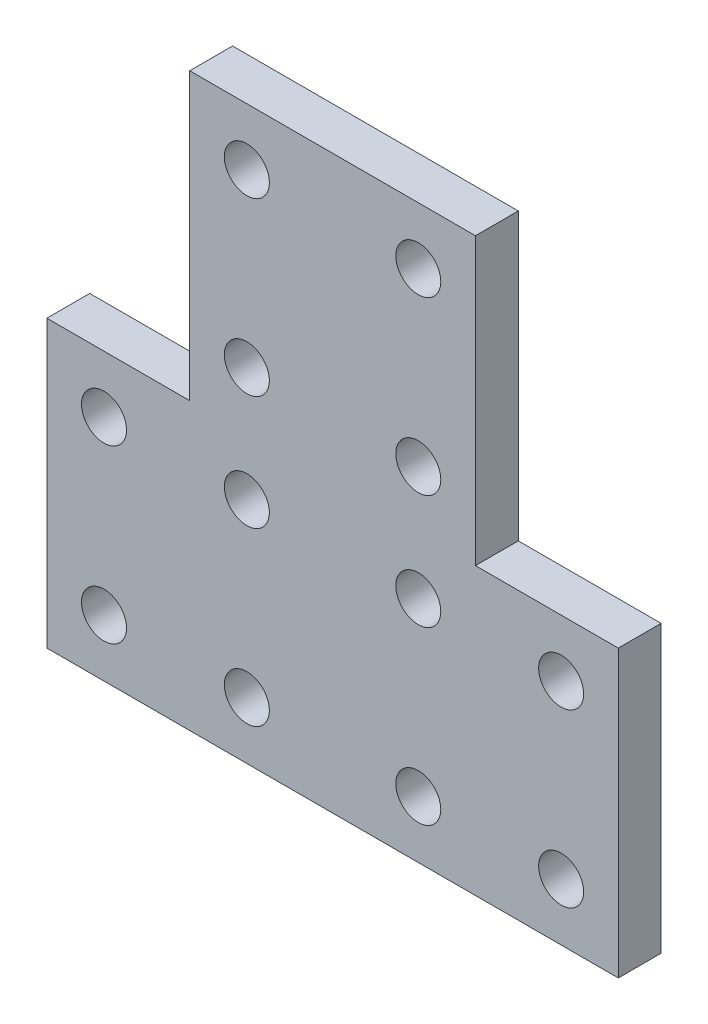
ISO-10303-21;
HEADER;
FILE_DESCRIPTION(('STEP AP214'),'2;1');
FILE_NAME('part.step','',(''),(''),'','','');
FILE_SCHEMA(('AUTOMOTIVE_DESIGN { 1 0 10303 214 1 1 1 1 }'));
ENDSEC;
DATA;
#1=APPLICATION_CONTEXT('core data for automotive mechanical design processes');
#2=APPLICATION_PROTOCOL_DEFINITION('international standard','automotive_design',2000,#1);
#3=PRODUCT_CONTEXT('',#1,'mechanical');
#4=PRODUCT('Part','Part','',(#3));
#5=PRODUCT_RELATED_PRODUCT_CATEGORY('part','',(#4));
#6=PRODUCT_DEFINITION_FORMATION('','',#4);
#7=PRODUCT_DEFINITION_CONTEXT('part definition',#1,'design');
#8=PRODUCT_DEFINITION('design','',#6,#7);
#9=PRODUCT_DEFINITION_SHAPE('','',#8);
#10=(LENGTH_UNIT() NAMED_UNIT(*) SI_UNIT(.MILLI.,.METRE.));
#11=(NAMED_UNIT(*) PLANE_ANGLE_UNIT() SI_UNIT($,.RADIAN.));
#12=(NAMED_UNIT(*) SI_UNIT($,.STERADIAN.) SOLID_ANGLE_UNIT());
#13=UNCERTAINTY_MEASURE_WITH_UNIT(LENGTH_MEASURE(1.E-05),#10,'distance_accuracy_value','');
#14=(GEOMETRIC_REPRESENTATION_CONTEXT(3) GLOBAL_UNCERTAINTY_ASSIGNED_CONTEXT((#13)) GLOBAL_UNIT_ASSIGNED_CONTEXT((#10,
#11,#12)) REPRESENTATION_CONTEXT('',''));
#15=CARTESIAN_POINT('',(0.,0.,0.));
#16=DIRECTION('',(0.,0.,1.));
#17=DIRECTION('',(1.,0.,0.));
#18=AXIS2_PLACEMENT_3D('',#15,#16,#17);
#19=CARTESIAN_POINT('',(0.,20.,3.));
#20=DIRECTION('',(1.,0.,0.));
#21=DIRECTION('',(0.,0.,-1.));
#22=AXIS2_PLACEMENT_3D('',#19,#20,#21);
#23=PLANE('',#22);
#24=DIRECTION('',(0.,-1.,0.));
#25=VECTOR('',#24,1.);
#26=CARTESIAN_POINT('',(0.,20.,0.));
#27=LINE('',#26,#25);
#28=CARTESIAN_POINT('',(0.,20.,0.));
#29=VERTEX_POINT('',#28);
#30=CARTESIAN_POINT('',(0.,0.,0.));
#31=VERTEX_POINT('',#30);
#32=EDGE_CURVE('E131',#29,#31,#27,.T.);
#33=ORIENTED_EDGE('',*,*,#32,.T.);
#34=DIRECTION('',(0.,0.,-1.));
#35=VECTOR('',#34,1.);
#36=CARTESIAN_POINT('',(0.,0.,3.));
#37=LINE('',#36,#35);
#38=CARTESIAN_POINT('',(0.,0.,3.));
#39=VERTEX_POINT('',#38);
#40=EDGE_CURVE('E11',#39,#31,#37,.T.);
#41=ORIENTED_EDGE('',*,*,#40,.F.);
#42=DIRECTION('',(0.,-1.,0.));
#43=VECTOR('',#42,1.);
#44=CARTESIAN_POINT('',(0.,20.,3.));
#45=LINE('',#44,#43);
#46=CARTESIAN_POINT('',(0.,20.,3.));
#47=VERTEX_POINT('',#46);
#48=EDGE_CURVE('E146',#47,#39,#45,.T.);
#49=ORIENTED_EDGE('',*,*,#48,.F.);
#50=DIRECTION('',(0.,0.,-1.));
#51=VECTOR('',#50,1.);
#52=CARTESIAN_POINT('',(0.,20.,3.));
#53=LINE('',#52,#51);
#54=EDGE_CURVE('E127',#47,#29,#53,.T.);
#55=ORIENTED_EDGE('',*,*,#54,.T.);
#56=EDGE_LOOP('',(#33,#41,#49,#55));
#57=FACE_BOUND('',#56,.T.);
#58=ADVANCED_FACE('F35',(#57),#23,.F.);
#59=CARTESIAN_POINT('',(0.,0.,3.));
#60=DIRECTION('',(0.,1.,0.));
#61=DIRECTION('',(0.,0.,1.));
#62=AXIS2_PLACEMENT_3D('',#59,#60,#61);
#63=PLANE('',#62);
#64=DIRECTION('',(1.,0.,0.));
#65=VECTOR('',#64,1.);
#66=CARTESIAN_POINT('',(0.,0.,0.));
#67=LINE('',#66,#65);
#68=CARTESIAN_POINT('',(40.,0.,0.));
#69=VERTEX_POINT('',#68);
#70=EDGE_CURVE('E134',#31,#69,#67,.T.);
#71=ORIENTED_EDGE('',*,*,#70,.T.);
#72=DIRECTION('',(0.,0.,-1.));
#73=VECTOR('',#72,1.);
#74=CARTESIAN_POINT('',(40.,0.,3.));
#75=LINE('',#74,#73);
#76=CARTESIAN_POINT('',(40.,0.,3.));
#77=VERTEX_POINT('',#76);
#78=EDGE_CURVE('E43',#77,#69,#75,.T.);
#79=ORIENTED_EDGE('',*,*,#78,.F.);
#80=DIRECTION('',(1.,0.,0.));
#81=VECTOR('',#80,1.);
#82=CARTESIAN_POINT('',(0.,0.,3.));
#83=LINE('',#82,#81);
#84=EDGE_CURVE('E94',#39,#77,#83,.T.);
#85=ORIENTED_EDGE('',*,*,#84,.F.);
#86=ORIENTED_EDGE('',*,*,#40,.T.);
#87=EDGE_LOOP('',(#71,#79,#85,#86));
#88=FACE_BOUND('',#87,.T.);
#89=ADVANCED_FACE('F288',(#88),#63,.F.);
#90=CARTESIAN_POINT('',(40.,0.,3.));
#91=DIRECTION('',(-1.,0.,0.));
#92=DIRECTION('',(0.,0.,1.));
#93=AXIS2_PLACEMENT_3D('',#90,#91,#92);
#94=PLANE('',#93);
#95=DIRECTION('',(0.,1.,0.));
#96=VECTOR('',#95,1.);
#97=CARTESIAN_POINT('',(40.,0.,0.));
#98=LINE('',#97,#96);
#99=CARTESIAN_POINT('',(40.,20.,0.));
#100=VERTEX_POINT('',#99);
#101=EDGE_CURVE('E137',#69,#100,#98,.T.);
#102=ORIENTED_EDGE('',*,*,#101,.T.);
#103=DIRECTION('',(0.,0.,-1.));
#104=VECTOR('',#103,1.);
#105=CARTESIAN_POINT('',(40.,20.,3.));
#106=LINE('',#105,#104);
#107=CARTESIAN_POINT('',(40.,20.,3.));
#108=VERTEX_POINT('',#107);
#109=EDGE_CURVE('E153',#108,#100,#106,.T.);
#110=ORIENTED_EDGE('',*,*,#109,.F.);
#111=DIRECTION('',(0.,1.,0.));
#112=VECTOR('',#111,1.);
#113=CARTESIAN_POINT('',(40.,0.,3.));
#114=LINE('',#113,#112);
#115=EDGE_CURVE('E161',#77,#108,#114,.T.);
#116=ORIENTED_EDGE('',*,*,#115,.F.);
#117=ORIENTED_EDGE('',*,*,#78,.T.);
#118=EDGE_LOOP('',(#102,#110,#116,#117));
#119=FACE_BOUND('',#118,.T.);
#120=ADVANCED_FACE('F159',(#119),#94,.F.);
#121=CARTESIAN_POINT('',(40.,20.,3.));
#122=DIRECTION('',(0.,-1.,0.));
#123=DIRECTION('',(1.,0.,0.));
#124=AXIS2_PLACEMENT_3D('',#121,#122,#123);
#125=PLANE('',#124);
#126=DIRECTION('',(-1.,0.,0.));
#127=VECTOR('',#126,1.);
#128=CARTESIAN_POINT('',(40.,20.,0.));
#129=LINE('',#128,#127);
#130=CARTESIAN_POINT('',(30.,20.,0.));
#131=VERTEX_POINT('',#130);
#132=EDGE_CURVE('E139',#100,#131,#129,.T.);
#133=ORIENTED_EDGE('',*,*,#132,.T.);
#134=DIRECTION('',(0.,0.,-1.));
#135=VECTOR('',#134,1.);
#136=CARTESIAN_POINT('',(30.,20.,3.));
#137=LINE('',#136,#135);
#138=CARTESIAN_POINT('',(30.,20.,3.));
#139=VERTEX_POINT('',#138);
#140=EDGE_CURVE('E150',#139,#131,#137,.T.);
#141=ORIENTED_EDGE('',*,*,#140,.F.);
#142=DIRECTION('',(-1.,0.,0.));
#143=VECTOR('',#142,1.);
#144=CARTESIAN_POINT('',(40.,20.,3.));
#145=LINE('',#144,#143);
#146=EDGE_CURVE('E173',#108,#139,#145,.T.);
#147=ORIENTED_EDGE('',*,*,#146,.F.);
#148=ORIENTED_EDGE('',*,*,#109,.T.);
#149=EDGE_LOOP('',(#133,#141,#147,#148));
#150=FACE_BOUND('',#149,.T.);
#151=ADVANCED_FACE('F169',(#150),#125,.F.);
#152=CARTESIAN_POINT('',(30.,20.,3.));
#153=DIRECTION('',(-1.,0.,0.));
#154=DIRECTION('',(0.,-1.,0.));
#155=AXIS2_PLACEMENT_3D('',#152,#153,#154);
#156=PLANE('',#155);
#157=DIRECTION('',(0.,1.,0.));
#158=VECTOR('',#157,1.);
#159=CARTESIAN_POINT('',(30.,20.,0.));
#160=LINE('',#159,#158);
#161=CARTESIAN_POINT('',(30.,40.,0.));
#162=VERTEX_POINT('',#161);
#163=EDGE_CURVE('E141',#131,#162,#160,.T.);
#164=ORIENTED_EDGE('',*,*,#163,.T.);
#165=DIRECTION('',(0.,0.,-1.));
#166=VECTOR('',#165,1.);
#167=CARTESIAN_POINT('',(30.,40.,3.));
#168=LINE('',#167,#166);
#169=CARTESIAN_POINT('',(30.,40.,3.));
#170=VERTEX_POINT('',#169);
#171=EDGE_CURVE('E122',#170,#162,#168,.T.);
#172=ORIENTED_EDGE('',*,*,#171,.F.);
#173=DIRECTION('',(0.,1.,0.));
#174=VECTOR('',#173,1.);
#175=CARTESIAN_POINT('',(30.,20.,3.));
#176=LINE('',#175,#174);
#177=EDGE_CURVE('E113',#139,#170,#176,.T.);
#178=ORIENTED_EDGE('',*,*,#177,.F.);
#179=ORIENTED_EDGE('',*,*,#140,.T.);
#180=EDGE_LOOP('',(#164,#172,#178,#179));
#181=FACE_BOUND('',#180,.T.);
#182=ADVANCED_FACE('F172',(#181),#156,.F.);
#183=CARTESIAN_POINT('',(30.,40.,3.));
#184=DIRECTION('',(0.,-1.,0.));
#185=DIRECTION('',(1.,0.,0.));
#186=AXIS2_PLACEMENT_3D('',#183,#184,#185);
#187=PLANE('',#186);
#188=DIRECTION('',(-1.,0.,0.));
#189=VECTOR('',#188,1.);
#190=CARTESIAN_POINT('',(30.,40.,0.));
#191=LINE('',#190,#189);
#192=CARTESIAN_POINT('',(9.99999999999999,40.,0.));
#193=VERTEX_POINT('',#192);
#194=EDGE_CURVE('E121',#162,#193,#191,.T.);
#195=ORIENTED_EDGE('',*,*,#194,.T.);
#196=DIRECTION('',(0.,0.,-1.));
#197=VECTOR('',#196,1.);
#198=CARTESIAN_POINT('',(9.99999999999999,40.,3.));
#199=LINE('',#198,#197);
#200=CARTESIAN_POINT('',(9.99999999999999,40.,3.));
#201=VERTEX_POINT('',#200);
#202=EDGE_CURVE('E118',#201,#193,#199,.T.);
#203=ORIENTED_EDGE('',*,*,#202,.F.);
#204=DIRECTION('',(-1.,0.,0.));
#205=VECTOR('',#204,1.);
#206=CARTESIAN_POINT('',(30.,40.,3.));
#207=LINE('',#206,#205);
#208=EDGE_CURVE('E107',#170,#201,#207,.T.);
#209=ORIENTED_EDGE('',*,*,#208,.F.);
#210=ORIENTED_EDGE('',*,*,#171,.T.);
#211=EDGE_LOOP('',(#195,#203,#209,#210));
#212=FACE_BOUND('',#211,.T.);
#213=ADVANCED_FACE('F119',(#212),#187,.F.);
#214=CARTESIAN_POINT('',(9.99999999999999,40.,3.));
#215=DIRECTION('',(1.,0.,0.));
#216=DIRECTION('',(0.,1.,0.));
#217=AXIS2_PLACEMENT_3D('',#214,#215,#216);
#218=PLANE('',#217);
#219=DIRECTION('',(0.,-1.,0.));
#220=VECTOR('',#219,1.);
#221=CARTESIAN_POINT('',(9.99999999999999,40.,0.));
#222=LINE('',#221,#220);
#223=CARTESIAN_POINT('',(10.,20.,0.));
#224=VERTEX_POINT('',#223);
#225=EDGE_CURVE('E80',#193,#224,#222,.T.);
#226=ORIENTED_EDGE('',*,*,#225,.T.);
#227=DIRECTION('',(0.,0.,-1.));
#228=VECTOR('',#227,1.);
#229=CARTESIAN_POINT('',(10.,20.,3.));
#230=LINE('',#229,#228);
#231=CARTESIAN_POINT('',(10.,20.,3.));
#232=VERTEX_POINT('',#231);
#233=EDGE_CURVE('E123',#232,#224,#230,.T.);
#234=ORIENTED_EDGE('',*,*,#233,.F.);
#235=DIRECTION('',(0.,-1.,0.));
#236=VECTOR('',#235,1.);
#237=CARTESIAN_POINT('',(9.99999999999999,40.,3.));
#238=LINE('',#237,#236);
#239=EDGE_CURVE('E111',#201,#232,#238,.T.);
#240=ORIENTED_EDGE('',*,*,#239,.F.);
#241=ORIENTED_EDGE('',*,*,#202,.T.);
#242=EDGE_LOOP('',(#226,#234,#240,#241));
#243=FACE_BOUND('',#242,.T.);
#244=ADVANCED_FACE('F125',(#243),#218,.F.);
#245=CARTESIAN_POINT('',(10.,20.,3.));
#246=DIRECTION('',(0.,-1.,0.));
#247=DIRECTION('',(0.,0.,-1.));
#248=AXIS2_PLACEMENT_3D('',#245,#246,#247);
#249=PLANE('',#248);
#250=DIRECTION('',(-1.,0.,0.));
#251=VECTOR('',#250,1.);
#252=CARTESIAN_POINT('',(10.,20.,0.));
#253=LINE('',#252,#251);
#254=EDGE_CURVE('E86',#224,#29,#253,.T.);
#255=ORIENTED_EDGE('',*,*,#254,.T.);
#256=ORIENTED_EDGE('',*,*,#54,.F.);
#257=DIRECTION('',(-1.,0.,0.));
#258=VECTOR('',#257,1.);
#259=CARTESIAN_POINT('',(10.,20.,3.));
#260=LINE('',#259,#258);
#261=EDGE_CURVE('E51',#232,#47,#260,.T.);
#262=ORIENTED_EDGE('',*,*,#261,.F.);
#263=ORIENTED_EDGE('',*,*,#233,.T.);
#264=EDGE_LOOP('',(#255,#256,#262,#263));
#265=FACE_BOUND('',#264,.T.);
#266=ADVANCED_FACE('F263',(#265),#249,.F.);
#267=CARTESIAN_POINT('',(0.,0.,3.));
#268=DIRECTION('',(0.,0.,1.));
#269=DIRECTION('',(1.,0.,0.));
#270=AXIS2_PLACEMENT_3D('',#267,#268,#269);
#271=PLANE('',#270);
#272=CARTESIAN_POINT('',(4.,4.,3.));
#273=DIRECTION('',(0.,0.,1.));
#274=DIRECTION('',(1.,0.,0.));
#275=AXIS2_PLACEMENT_3D('',#272,#273,#274);
#276=CIRCLE('',#275,1.575);
#277=CARTESIAN_POINT('',(5.575,4.,3.));
#278=VERTEX_POINT('',#277);
#279=EDGE_CURVE('E216',#278,#278,#276,.T.);
#280=ORIENTED_EDGE('',*,*,#279,.F.);
#281=EDGE_LOOP('',(#280));
#282=FACE_BOUND('',#281,.T.);
#283=CARTESIAN_POINT('',(14.,16.,3.));
#284=DIRECTION('',(0.,0.,1.));
#285=DIRECTION('',(1.,0.,0.));
#286=AXIS2_PLACEMENT_3D('',#283,#284,#285);
#287=CIRCLE('',#286,1.575);
#288=CARTESIAN_POINT('',(15.575,16.,3.));
#289=VERTEX_POINT('',#288);
#290=EDGE_CURVE('E209',#289,#289,#287,.T.);
#291=ORIENTED_EDGE('',*,*,#290,.F.);
#292=EDGE_LOOP('',(#291));
#293=FACE_BOUND('',#292,.T.);
#294=CARTESIAN_POINT('',(14.,4.,3.));
#295=DIRECTION('',(0.,0.,1.));
#296=DIRECTION('',(1.,0.,0.));
#297=AXIS2_PLACEMENT_3D('',#294,#295,#296);
#298=CIRCLE('',#297,1.575);
#299=CARTESIAN_POINT('',(15.575,4.,3.));
#300=VERTEX_POINT('',#299);
#301=EDGE_CURVE('E228',#300,#300,#298,.T.);
#302=ORIENTED_EDGE('',*,*,#301,.F.);
#303=EDGE_LOOP('',(#302));
#304=FACE_BOUND('',#303,.T.);
#305=CARTESIAN_POINT('',(36.,16.,3.));
#306=DIRECTION('',(0.,0.,1.));
#307=DIRECTION('',(1.,0.,0.));
#308=AXIS2_PLACEMENT_3D('',#305,#306,#307);
#309=CIRCLE('',#308,1.575);
#310=CARTESIAN_POINT('',(37.575,16.,3.));
#311=VERTEX_POINT('',#310);
#312=EDGE_CURVE('E221',#311,#311,#309,.T.);
#313=ORIENTED_EDGE('',*,*,#312,.F.);
#314=EDGE_LOOP('',(#313));
#315=FACE_BOUND('',#314,.T.);
#316=CARTESIAN_POINT('',(4.,16.,3.));
#317=DIRECTION('',(0.,0.,1.));
#318=DIRECTION('',(1.,0.,0.));
#319=AXIS2_PLACEMENT_3D('',#316,#317,#318);
#320=CIRCLE('',#319,1.575);
#321=CARTESIAN_POINT('',(5.575,16.,3.));
#322=VERTEX_POINT('',#321);
#323=EDGE_CURVE('E185',#322,#322,#320,.T.);
#324=ORIENTED_EDGE('',*,*,#323,.F.);
#325=EDGE_LOOP('',(#324));
#326=FACE_BOUND('',#325,.T.);
#327=CARTESIAN_POINT('',(14.,24.,3.));
#328=DIRECTION('',(0.,0.,1.));
#329=DIRECTION('',(1.,0.,0.));
#330=AXIS2_PLACEMENT_3D('',#327,#328,#329);
#331=CIRCLE('',#330,1.575);
#332=CARTESIAN_POINT('',(15.575,24.,3.));
#333=VERTEX_POINT('',#332);
#334=EDGE_CURVE('E192',#333,#333,#331,.T.);
#335=ORIENTED_EDGE('',*,*,#334,.F.);
#336=EDGE_LOOP('',(#335));
#337=FACE_BOUND('',#336,.T.);
#338=CARTESIAN_POINT('',(26.,24.,3.));
#339=DIRECTION('',(0.,0.,1.));
#340=DIRECTION('',(1.,0.,0.));
#341=AXIS2_PLACEMENT_3D('',#338,#339,#340);
#342=CIRCLE('',#341,1.575);
#343=CARTESIAN_POINT('',(27.575,24.,3.));
#344=VERTEX_POINT('',#343);
#345=EDGE_CURVE('E198',#344,#344,#342,.T.);
#346=ORIENTED_EDGE('',*,*,#345,.F.);
#347=EDGE_LOOP('',(#346));
#348=FACE_BOUND('',#347,.T.);
#349=CARTESIAN_POINT('',(26.,36.,3.));
#350=DIRECTION('',(0.,0.,1.));
#351=DIRECTION('',(1.,0.,0.));
#352=AXIS2_PLACEMENT_3D('',#349,#350,#351);
#353=CIRCLE('',#352,1.575);
#354=CARTESIAN_POINT('',(27.575,36.,3.));
#355=VERTEX_POINT('',#354);
#356=EDGE_CURVE('E204',#355,#355,#353,.T.);
#357=ORIENTED_EDGE('',*,*,#356,.F.);
#358=EDGE_LOOP('',(#357));
#359=FACE_BOUND('',#358,.T.);
#360=CARTESIAN_POINT('',(36.,4.,3.));
#361=DIRECTION('',(0.,0.,1.));
#362=DIRECTION('',(1.,0.,0.));
#363=AXIS2_PLACEMENT_3D('',#360,#361,#362);
#364=CIRCLE('',#363,1.575);
#365=CARTESIAN_POINT('',(37.575,4.,3.));
#366=VERTEX_POINT('',#365);
#367=EDGE_CURVE('E245',#366,#366,#364,.T.);
#368=ORIENTED_EDGE('',*,*,#367,.F.);
#369=EDGE_LOOP('',(#368));
#370=FACE_BOUND('',#369,.T.);
#371=CARTESIAN_POINT('',(26.,4.,3.));
#372=DIRECTION('',(0.,0.,1.));
#373=DIRECTION('',(1.,0.,0.));
#374=AXIS2_PLACEMENT_3D('',#371,#372,#373);
#375=CIRCLE('',#374,1.575);
#376=CARTESIAN_POINT('',(27.575,4.,3.));
#377=VERTEX_POINT('',#376);
#378=EDGE_CURVE('E239',#377,#377,#375,.T.);
#379=ORIENTED_EDGE('',*,*,#378,.F.);
#380=EDGE_LOOP('',(#379));
#381=FACE_BOUND('',#380,.T.);
#382=CARTESIAN_POINT('',(26.,16.,3.));
#383=DIRECTION('',(0.,0.,1.));
#384=DIRECTION('',(1.,0.,0.));
#385=AXIS2_PLACEMENT_3D('',#382,#383,#384);
#386=CIRCLE('',#385,1.575);
#387=CARTESIAN_POINT('',(27.575,16.,3.));
#388=VERTEX_POINT('',#387);
#389=EDGE_CURVE('E233',#388,#388,#386,.T.);
#390=ORIENTED_EDGE('',*,*,#389,.F.);
#391=EDGE_LOOP('',(#390));
#392=FACE_BOUND('',#391,.T.);
#393=CARTESIAN_POINT('',(14.,36.,3.));
#394=DIRECTION('',(0.,0.,1.));
#395=DIRECTION('',(1.,0.,0.));
#396=AXIS2_PLACEMENT_3D('',#393,#394,#395);
#397=CIRCLE('',#396,1.575);
#398=CARTESIAN_POINT('',(15.575,36.,3.));
#399=VERTEX_POINT('',#398);
#400=EDGE_CURVE('E179',#399,#399,#397,.T.);
#401=ORIENTED_EDGE('',*,*,#400,.F.);
#402=EDGE_LOOP('',(#401));
#403=FACE_BOUND('',#402,.T.);
#404=ORIENTED_EDGE('',*,*,#48,.T.);
#405=ORIENTED_EDGE('',*,*,#84,.T.);
#406=ORIENTED_EDGE('',*,*,#115,.T.);
#407=ORIENTED_EDGE('',*,*,#146,.T.);
#408=ORIENTED_EDGE('',*,*,#177,.T.);
#409=ORIENTED_EDGE('',*,*,#208,.T.);
#410=ORIENTED_EDGE('',*,*,#239,.T.);
#411=ORIENTED_EDGE('',*,*,#261,.T.);
#412=EDGE_LOOP('',(#404,#405,#406,#407,#408,#409,#410,#411));
#413=FACE_BOUND('',#412,.T.);
#414=ADVANCED_FACE('F109',(#282,#293,#304,#315,#326,#337,#348,#359,#370,#381,#392,#403,#413),
#271,.T.);
#415=CARTESIAN_POINT('',(0.,0.,0.));
#416=DIRECTION('',(0.,0.,1.));
#417=DIRECTION('',(1.,0.,0.));
#418=AXIS2_PLACEMENT_3D('',#415,#416,#417);
#419=PLANE('',#418);
#420=CARTESIAN_POINT('',(4.,4.,0.));
#421=DIRECTION('',(0.,0.,1.));
#422=DIRECTION('',(1.,0.,0.));
#423=AXIS2_PLACEMENT_3D('',#420,#421,#422);
#424=CIRCLE('',#423,1.575);
#425=CARTESIAN_POINT('',(5.575,4.,0.));
#426=VERTEX_POINT('',#425);
#427=EDGE_CURVE('E189',#426,#426,#424,.T.);
#428=ORIENTED_EDGE('',*,*,#427,.T.);
#429=EDGE_LOOP('',(#428));
#430=FACE_BOUND('',#429,.T.);
#431=CARTESIAN_POINT('',(14.,16.,0.));
#432=DIRECTION('',(0.,0.,1.));
#433=DIRECTION('',(1.,0.,0.));
#434=AXIS2_PLACEMENT_3D('',#431,#432,#433);
#435=CIRCLE('',#434,1.575);
#436=CARTESIAN_POINT('',(15.575,16.,0.));
#437=VERTEX_POINT('',#436);
#438=EDGE_CURVE('E212',#437,#437,#435,.T.);
#439=ORIENTED_EDGE('',*,*,#438,.T.);
#440=EDGE_LOOP('',(#439));
#441=FACE_BOUND('',#440,.T.);
#442=CARTESIAN_POINT('',(14.,4.,0.));
#443=DIRECTION('',(0.,0.,1.));
#444=DIRECTION('',(1.,0.,0.));
#445=AXIS2_PLACEMENT_3D('',#442,#443,#444);
#446=CIRCLE('',#445,1.575);
#447=CARTESIAN_POINT('',(15.575,4.,0.));
#448=VERTEX_POINT('',#447);
#449=EDGE_CURVE('E213',#448,#448,#446,.T.);
#450=ORIENTED_EDGE('',*,*,#449,.T.);
#451=EDGE_LOOP('',(#450));
#452=FACE_BOUND('',#451,.T.);
#453=CARTESIAN_POINT('',(36.,16.,0.));
#454=DIRECTION('',(0.,0.,1.));
#455=DIRECTION('',(1.,0.,0.));
#456=AXIS2_PLACEMENT_3D('',#453,#454,#455);
#457=CIRCLE('',#456,1.575);
#458=CARTESIAN_POINT('',(37.575,16.,0.));
#459=VERTEX_POINT('',#458);
#460=EDGE_CURVE('E224',#459,#459,#457,.T.);
#461=ORIENTED_EDGE('',*,*,#460,.T.);
#462=EDGE_LOOP('',(#461));
#463=FACE_BOUND('',#462,.T.);
#464=CARTESIAN_POINT('',(4.,16.,0.));
#465=DIRECTION('',(0.,0.,1.));
#466=DIRECTION('',(1.,0.,0.));
#467=AXIS2_PLACEMENT_3D('',#464,#465,#466);
#468=CIRCLE('',#467,1.575);
#469=CARTESIAN_POINT('',(5.575,16.,0.));
#470=VERTEX_POINT('',#469);
#471=EDGE_CURVE('E188',#470,#470,#468,.T.);
#472=ORIENTED_EDGE('',*,*,#471,.T.);
#473=EDGE_LOOP('',(#472));
#474=FACE_BOUND('',#473,.T.);
#475=CARTESIAN_POINT('',(14.,24.,0.));
#476=DIRECTION('',(0.,0.,1.));
#477=DIRECTION('',(1.,0.,0.));
#478=AXIS2_PLACEMENT_3D('',#475,#476,#477);
#479=CIRCLE('',#478,1.575);
#480=CARTESIAN_POINT('',(15.575,24.,0.));
#481=VERTEX_POINT('',#480);
#482=EDGE_CURVE('E195',#481,#481,#479,.T.);
#483=ORIENTED_EDGE('',*,*,#482,.T.);
#484=EDGE_LOOP('',(#483));
#485=FACE_BOUND('',#484,.T.);
#486=CARTESIAN_POINT('',(26.,24.,0.));
#487=DIRECTION('',(0.,0.,1.));
#488=DIRECTION('',(1.,0.,0.));
#489=AXIS2_PLACEMENT_3D('',#486,#487,#488);
#490=CIRCLE('',#489,1.575);
#491=CARTESIAN_POINT('',(27.575,24.,0.));
#492=VERTEX_POINT('',#491);
#493=EDGE_CURVE('E201',#492,#492,#490,.T.);
#494=ORIENTED_EDGE('',*,*,#493,.T.);
#495=EDGE_LOOP('',(#494));
#496=FACE_BOUND('',#495,.T.);
#497=CARTESIAN_POINT('',(26.,36.,0.));
#498=DIRECTION('',(0.,0.,1.));
#499=DIRECTION('',(1.,0.,0.));
#500=AXIS2_PLACEMENT_3D('',#497,#498,#499);
#501=CIRCLE('',#500,1.575);
#502=CARTESIAN_POINT('',(27.575,36.,0.));
#503=VERTEX_POINT('',#502);
#504=EDGE_CURVE('E182',#503,#503,#501,.T.);
#505=ORIENTED_EDGE('',*,*,#504,.T.);
#506=EDGE_LOOP('',(#505));
#507=FACE_BOUND('',#506,.T.);
#508=CARTESIAN_POINT('',(36.,4.,0.));
#509=DIRECTION('',(0.,0.,1.));
#510=DIRECTION('',(1.,0.,0.));
#511=AXIS2_PLACEMENT_3D('',#508,#509,#510);
#512=CIRCLE('',#511,1.575);
#513=CARTESIAN_POINT('',(37.575,4.,0.));
#514=VERTEX_POINT('',#513);
#515=EDGE_CURVE('E225',#514,#514,#512,.T.);
#516=ORIENTED_EDGE('',*,*,#515,.T.);
#517=EDGE_LOOP('',(#516));
#518=FACE_BOUND('',#517,.T.);
#519=CARTESIAN_POINT('',(26.,4.,0.));
#520=DIRECTION('',(0.,0.,1.));
#521=DIRECTION('',(1.,0.,0.));
#522=AXIS2_PLACEMENT_3D('',#519,#520,#521);
#523=CIRCLE('',#522,1.575);
#524=CARTESIAN_POINT('',(27.575,4.,0.));
#525=VERTEX_POINT('',#524);
#526=EDGE_CURVE('E242',#525,#525,#523,.T.);
#527=ORIENTED_EDGE('',*,*,#526,.T.);
#528=EDGE_LOOP('',(#527));
#529=FACE_BOUND('',#528,.T.);
#530=CARTESIAN_POINT('',(26.,16.,0.));
#531=DIRECTION('',(0.,0.,1.));
#532=DIRECTION('',(1.,0.,0.));
#533=AXIS2_PLACEMENT_3D('',#530,#531,#532);
#534=CIRCLE('',#533,1.575);
#535=CARTESIAN_POINT('',(27.575,16.,0.));
#536=VERTEX_POINT('',#535);
#537=EDGE_CURVE('E236',#536,#536,#534,.T.);
#538=ORIENTED_EDGE('',*,*,#537,.T.);
#539=EDGE_LOOP('',(#538));
#540=FACE_BOUND('',#539,.T.);
#541=CARTESIAN_POINT('',(14.,36.,0.));
#542=DIRECTION('',(0.,0.,1.));
#543=DIRECTION('',(1.,0.,0.));
#544=AXIS2_PLACEMENT_3D('',#541,#542,#543);
#545=CIRCLE('',#544,1.575);
#546=CARTESIAN_POINT('',(15.575,36.,0.));
#547=VERTEX_POINT('',#546);
#548=EDGE_CURVE('E135',#547,#547,#545,.T.);
#549=ORIENTED_EDGE('',*,*,#548,.T.);
#550=EDGE_LOOP('',(#549));
#551=FACE_BOUND('',#550,.T.);
#552=ORIENTED_EDGE('',*,*,#32,.F.);
#553=ORIENTED_EDGE('',*,*,#254,.F.);
#554=ORIENTED_EDGE('',*,*,#225,.F.);
#555=ORIENTED_EDGE('',*,*,#194,.F.);
#556=ORIENTED_EDGE('',*,*,#163,.F.);
#557=ORIENTED_EDGE('',*,*,#132,.F.);
#558=ORIENTED_EDGE('',*,*,#101,.F.);
#559=ORIENTED_EDGE('',*,*,#70,.F.);
#560=EDGE_LOOP('',(#552,#553,#554,#555,#556,#557,#558,#559));
#561=FACE_BOUND('',#560,.T.);
#562=ADVANCED_FACE('F165',(#430,#441,#452,#463,#474,#485,#496,#507,#518,#529,#540,#551,#561),
#419,.F.);
#563=CARTESIAN_POINT('',(14.,36.,0.));
#564=DIRECTION('',(0.,0.,1.));
#565=DIRECTION('',(1.,0.,0.));
#566=AXIS2_PLACEMENT_3D('',#563,#564,#565);
#567=CYLINDRICAL_SURFACE('',#566,1.575);
#568=ORIENTED_EDGE('',*,*,#548,.F.);
#569=EDGE_LOOP('',(#568));
#570=FACE_BOUND('',#569,.T.);
#571=ORIENTED_EDGE('',*,*,#400,.T.);
#572=EDGE_LOOP('',(#571));
#573=FACE_BOUND('',#572,.T.);
#574=ADVANCED_FACE('F272',(#570,#573),#567,.F.);
#575=CARTESIAN_POINT('',(26.,16.,0.));
#576=DIRECTION('',(0.,0.,1.));
#577=DIRECTION('',(1.,0.,0.));
#578=AXIS2_PLACEMENT_3D('',#575,#576,#577);
#579=CYLINDRICAL_SURFACE('',#578,1.575);
#580=ORIENTED_EDGE('',*,*,#537,.F.);
#581=EDGE_LOOP('',(#580));
#582=FACE_BOUND('',#581,.T.);
#583=ORIENTED_EDGE('',*,*,#389,.T.);
#584=EDGE_LOOP('',(#583));
#585=FACE_BOUND('',#584,.T.);
#586=ADVANCED_FACE('F274',(#582,#585),#579,.F.);
#587=CARTESIAN_POINT('',(26.,4.,0.));
#588=DIRECTION('',(0.,0.,1.));
#589=DIRECTION('',(1.,0.,0.));
#590=AXIS2_PLACEMENT_3D('',#587,#588,#589);
#591=CYLINDRICAL_SURFACE('',#590,1.575);
#592=ORIENTED_EDGE('',*,*,#526,.F.);
#593=EDGE_LOOP('',(#592));
#594=FACE_BOUND('',#593,.T.);
#595=ORIENTED_EDGE('',*,*,#378,.T.);
#596=EDGE_LOOP('',(#595));
#597=FACE_BOUND('',#596,.T.);
#598=ADVANCED_FACE('F257',(#594,#597),#591,.F.);
#599=CARTESIAN_POINT('',(36.,4.,0.));
#600=DIRECTION('',(0.,0.,1.));
#601=DIRECTION('',(1.,0.,0.));
#602=AXIS2_PLACEMENT_3D('',#599,#600,#601);
#603=CYLINDRICAL_SURFACE('',#602,1.575);
#604=ORIENTED_EDGE('',*,*,#515,.F.);
#605=EDGE_LOOP('',(#604));
#606=FACE_BOUND('',#605,.T.);
#607=ORIENTED_EDGE('',*,*,#367,.T.);
#608=EDGE_LOOP('',(#607));
#609=FACE_BOUND('',#608,.T.);
#610=ADVANCED_FACE('F253',(#606,#609),#603,.F.);
#611=CARTESIAN_POINT('',(26.,36.,0.));
#612=DIRECTION('',(0.,0.,1.));
#613=DIRECTION('',(1.,0.,0.));
#614=AXIS2_PLACEMENT_3D('',#611,#612,#613);
#615=CYLINDRICAL_SURFACE('',#614,1.575);
#616=ORIENTED_EDGE('',*,*,#504,.F.);
#617=EDGE_LOOP('',(#616));
#618=FACE_BOUND('',#617,.T.);
#619=ORIENTED_EDGE('',*,*,#356,.T.);
#620=EDGE_LOOP('',(#619));
#621=FACE_BOUND('',#620,.T.);
#622=ADVANCED_FACE('F256',(#618,#621),#615,.F.);
#623=CARTESIAN_POINT('',(26.,24.,0.));
#624=DIRECTION('',(0.,0.,1.));
#625=DIRECTION('',(1.,0.,0.));
#626=AXIS2_PLACEMENT_3D('',#623,#624,#625);
#627=CYLINDRICAL_SURFACE('',#626,1.575);
#628=ORIENTED_EDGE('',*,*,#493,.F.);
#629=EDGE_LOOP('',(#628));
#630=FACE_BOUND('',#629,.T.);
#631=ORIENTED_EDGE('',*,*,#345,.T.);
#632=EDGE_LOOP('',(#631));
#633=FACE_BOUND('',#632,.T.);
#634=ADVANCED_FACE('F379',(#630,#633),#627,.F.);
#635=CARTESIAN_POINT('',(14.,24.,0.));
#636=DIRECTION('',(0.,0.,1.));
#637=DIRECTION('',(1.,0.,0.));
#638=AXIS2_PLACEMENT_3D('',#635,#636,#637);
#639=CYLINDRICAL_SURFACE('',#638,1.575);
#640=ORIENTED_EDGE('',*,*,#482,.F.);
#641=EDGE_LOOP('',(#640));
#642=FACE_BOUND('',#641,.T.);
#643=ORIENTED_EDGE('',*,*,#334,.T.);
#644=EDGE_LOOP('',(#643));
#645=FACE_BOUND('',#644,.T.);
#646=ADVANCED_FACE('F389',(#642,#645),#639,.F.);
#647=CARTESIAN_POINT('',(4.,16.,0.));
#648=DIRECTION('',(0.,0.,1.));
#649=DIRECTION('',(1.,0.,0.));
#650=AXIS2_PLACEMENT_3D('',#647,#648,#649);
#651=CYLINDRICAL_SURFACE('',#650,1.575);
#652=ORIENTED_EDGE('',*,*,#471,.F.);
#653=EDGE_LOOP('',(#652));
#654=FACE_BOUND('',#653,.T.);
#655=ORIENTED_EDGE('',*,*,#323,.T.);
#656=EDGE_LOOP('',(#655));
#657=FACE_BOUND('',#656,.T.);
#658=ADVANCED_FACE('F399',(#654,#657),#651,.F.);
#659=CARTESIAN_POINT('',(36.,16.,0.));
#660=DIRECTION('',(0.,0.,1.));
#661=DIRECTION('',(1.,0.,0.));
#662=AXIS2_PLACEMENT_3D('',#659,#660,#661);
#663=CYLINDRICAL_SURFACE('',#662,1.575);
#664=ORIENTED_EDGE('',*,*,#460,.F.);
#665=EDGE_LOOP('',(#664));
#666=FACE_BOUND('',#665,.T.);
#667=ORIENTED_EDGE('',*,*,#312,.T.);
#668=EDGE_LOOP('',(#667));
#669=FACE_BOUND('',#668,.T.);
#670=ADVANCED_FACE('F409',(#666,#669),#663,.F.);
#671=CARTESIAN_POINT('',(14.,4.,0.));
#672=DIRECTION('',(0.,0.,1.));
#673=DIRECTION('',(1.,0.,0.));
#674=AXIS2_PLACEMENT_3D('',#671,#672,#673);
#675=CYLINDRICAL_SURFACE('',#674,1.575);
#676=ORIENTED_EDGE('',*,*,#449,.F.);
#677=EDGE_LOOP('',(#676));
#678=FACE_BOUND('',#677,.T.);
#679=ORIENTED_EDGE('',*,*,#301,.T.);
#680=EDGE_LOOP('',(#679));
#681=FACE_BOUND('',#680,.T.);
#682=ADVANCED_FACE('F418',(#678,#681),#675,.F.);
#683=CARTESIAN_POINT('',(14.,16.,0.));
#684=DIRECTION('',(0.,0.,1.));
#685=DIRECTION('',(1.,0.,0.));
#686=AXIS2_PLACEMENT_3D('',#683,#684,#685);
#687=CYLINDRICAL_SURFACE('',#686,1.575);
#688=ORIENTED_EDGE('',*,*,#438,.F.);
#689=EDGE_LOOP('',(#688));
#690=FACE_BOUND('',#689,.T.);
#691=ORIENTED_EDGE('',*,*,#290,.T.);
#692=EDGE_LOOP('',(#691));
#693=FACE_BOUND('',#692,.T.);
#694=ADVANCED_FACE('F428',(#690,#693),#687,.F.);
#695=CARTESIAN_POINT('',(4.,4.,0.));
#696=DIRECTION('',(0.,0.,1.));
#697=DIRECTION('',(1.,0.,0.));
#698=AXIS2_PLACEMENT_3D('',#695,#696,#697);
#699=CYLINDRICAL_SURFACE('',#698,1.575);
#700=ORIENTED_EDGE('',*,*,#427,.F.);
#701=EDGE_LOOP('',(#700));
#702=FACE_BOUND('',#701,.T.);
#703=ORIENTED_EDGE('',*,*,#279,.T.);
#704=EDGE_LOOP('',(#703));
#705=FACE_BOUND('',#704,.T.);
#706=ADVANCED_FACE('F438',(#702,#705),#699,.F.);
#707=CLOSED_SHELL('',(#58,#89,#120,#151,#182,#213,#244,#266,#414,#562,#574,#586,#598,#610,#622,
#634,#646,#658,#670,#682,#694,#706));
#708=MANIFOLD_SOLID_BREP('B2',#707);
#709=ADVANCED_BREP_SHAPE_REPRESENTATION('',(#18,#708),#14);
#710=SHAPE_DEFINITION_REPRESENTATION(#9,#709);
ENDSEC;
END-ISO-10303-21;
